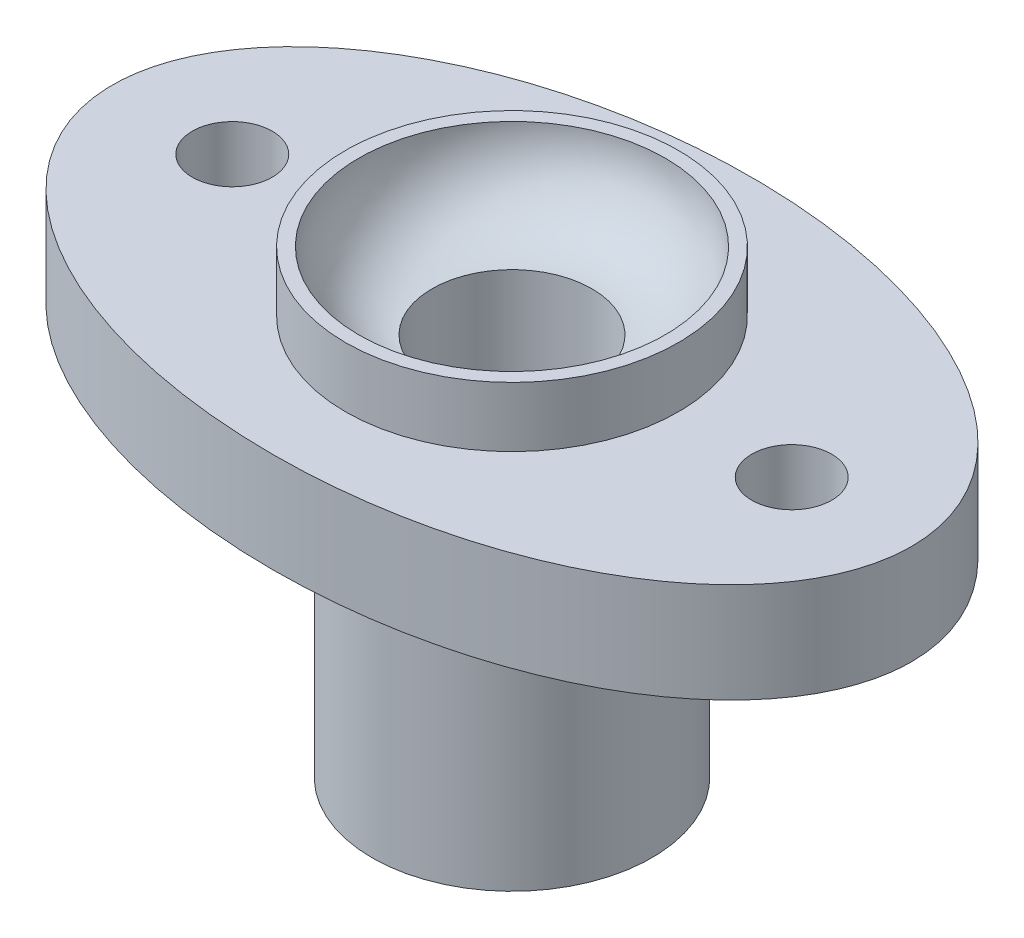
ISO-10303-21;
HEADER;
FILE_DESCRIPTION(('STEP AP214'),'2;1');
FILE_NAME('part.step','',(''),(''),'','','');
FILE_SCHEMA(('AUTOMOTIVE_DESIGN { 1 0 10303 214 1 1 1 1 }'));
ENDSEC;
DATA;
#1=APPLICATION_CONTEXT('core data for automotive mechanical design processes');
#2=APPLICATION_PROTOCOL_DEFINITION('international standard','automotive_design',2000,#1);
#3=PRODUCT_CONTEXT('',#1,'mechanical');
#4=PRODUCT('Part','Part','',(#3));
#5=PRODUCT_RELATED_PRODUCT_CATEGORY('part','',(#4));
#6=PRODUCT_DEFINITION_FORMATION('','',#4);
#7=PRODUCT_DEFINITION_CONTEXT('part definition',#1,'design');
#8=PRODUCT_DEFINITION('design','',#6,#7);
#9=PRODUCT_DEFINITION_SHAPE('','',#8);
#10=(LENGTH_UNIT() NAMED_UNIT(*) SI_UNIT(.MILLI.,.METRE.));
#11=(NAMED_UNIT(*) PLANE_ANGLE_UNIT() SI_UNIT($,.RADIAN.));
#12=(NAMED_UNIT(*) SI_UNIT($,.STERADIAN.) SOLID_ANGLE_UNIT());
#13=UNCERTAINTY_MEASURE_WITH_UNIT(LENGTH_MEASURE(1.E-05),#10,'distance_accuracy_value','');
#14=(GEOMETRIC_REPRESENTATION_CONTEXT(3) GLOBAL_UNCERTAINTY_ASSIGNED_CONTEXT((#13)) GLOBAL_UNIT_ASSIGNED_CONTEXT((#10,
#11,#12)) REPRESENTATION_CONTEXT('',''));
#15=CARTESIAN_POINT('',(0.,0.,0.));
#16=DIRECTION('',(0.,0.,1.));
#17=DIRECTION('',(1.,0.,0.));
#18=AXIS2_PLACEMENT_3D('',#15,#16,#17);
#19=CARTESIAN_POINT('',(0.,45.,0.));
#20=DIRECTION('',(0.,-1.,0.));
#21=DIRECTION('',(0.,0.,-1.));
#22=AXIS2_PLACEMENT_3D('',#19,#20,#21);
#23=CYLINDRICAL_SURFACE('',#22,12.);
#24=CARTESIAN_POINT('',(0.,2.41154273188011,0.));
#25=DIRECTION('',(0.,-1.,0.));
#26=DIRECTION('',(0.,0.,-1.));
#27=AXIS2_PLACEMENT_3D('',#24,#25,#26);
#28=CIRCLE('',#27,12.);
#29=CARTESIAN_POINT('',(0.,2.41154273188011,-12.));
#30=VERTEX_POINT('',#29);
#31=EDGE_CURVE('E72',#30,#30,#28,.F.);
#32=CARTESIAN_POINT('',(0.,57.5108747069239,0.));
#33=DIRECTION('',(0.,1.,0.));
#34=DIRECTION('',(0.,0.,1.));
#35=AXIS2_PLACEMENT_3D('',#32,#33,#34);
#36=CIRCLE('',#35,12.);
#37=CARTESIAN_POINT('',(0.,57.5108747069239,-12.));
#38=VERTEX_POINT('',#37);
#39=EDGE_CURVE('E75',#38,#38,#36,.T.);
#40=CARTESIAN_POINT('',(0.,2.41154273188011,-12.));
#41=CARTESIAN_POINT('',(0.,2.98549410662015,-12.));
#42=CARTESIAN_POINT('',(0.,3.55944548136019,-12.));
#43=CARTESIAN_POINT('',(0.,4.70734823084027,-12.));
#44=CARTESIAN_POINT('',(0.,5.28129960558031,-12.));
#45=CARTESIAN_POINT('',(0.,6.42920235506039,-12.));
#46=CARTESIAN_POINT('',(0.,7.00315372980043,-12.));
#47=CARTESIAN_POINT('',(0.,8.15105647928051,-12.));
#48=CARTESIAN_POINT('',(0.,8.72500785402055,-12.));
#49=CARTESIAN_POINT('',(0.,9.87291060350063,-12.));
#50=CARTESIAN_POINT('',(0.,10.4468619782407,-12.));
#51=CARTESIAN_POINT('',(0.,11.5947647277208,-12.));
#52=CARTESIAN_POINT('',(0.,12.1687161024608,-12.));
#53=CARTESIAN_POINT('',(0.,13.3166188519409,-12.));
#54=CARTESIAN_POINT('',(0.,13.8905702266809,-12.));
#55=CARTESIAN_POINT('',(0.,15.038472976161,-12.));
#56=CARTESIAN_POINT('',(0.,15.612424350901,-12.));
#57=CARTESIAN_POINT('',(0.,16.7603271003811,-12.));
#58=CARTESIAN_POINT('',(0.,17.3342784751211,-12.));
#59=CARTESIAN_POINT('',(0.,18.4821812246012,-12.));
#60=CARTESIAN_POINT('',(0.,19.0561325993413,-12.));
#61=CARTESIAN_POINT('',(0.,20.2040353488213,-12.));
#62=CARTESIAN_POINT('',(0.,20.7779867235614,-12.));
#63=CARTESIAN_POINT('',(0.,21.9258894730415,-12.));
#64=CARTESIAN_POINT('',(0.,22.4998408477815,-12.));
#65=CARTESIAN_POINT('',(0.,23.6477435972616,-12.));
#66=CARTESIAN_POINT('',(0.,24.2216949720016,-12.));
#67=CARTESIAN_POINT('',(0.,25.3695977214817,-12.));
#68=CARTESIAN_POINT('',(0.,25.9435490962217,-12.));
#69=CARTESIAN_POINT('',(0.,27.0914518457018,-12.));
#70=CARTESIAN_POINT('',(0.,27.6654032204419,-12.));
#71=CARTESIAN_POINT('',(0.,28.8133059699219,-12.));
#72=CARTESIAN_POINT('',(0.,29.387257344662,-12.));
#73=CARTESIAN_POINT('',(0.,30.5351600941421,-12.));
#74=CARTESIAN_POINT('',(0.,31.1091114688821,-12.));
#75=CARTESIAN_POINT('',(0.,32.2570142183622,-12.));
#76=CARTESIAN_POINT('',(0.,32.8309655931022,-12.));
#77=CARTESIAN_POINT('',(0.,33.9788683425823,-12.));
#78=CARTESIAN_POINT('',(0.,34.5528197173223,-12.));
#79=CARTESIAN_POINT('',(0.,35.7007224668024,-12.));
#80=CARTESIAN_POINT('',(0.,36.2746738415425,-12.));
#81=CARTESIAN_POINT('',(0.,37.4225765910225,-12.));
#82=CARTESIAN_POINT('',(0.,37.9965279657626,-12.));
#83=CARTESIAN_POINT('',(0.,39.1444307152427,-12.));
#84=CARTESIAN_POINT('',(0.,39.7183820899827,-12.));
#85=CARTESIAN_POINT('',(0.,40.8662848394628,-12.));
#86=CARTESIAN_POINT('',(0.,41.4402362142028,-12.));
#87=CARTESIAN_POINT('',(0.,42.5881389636829,-12.));
#88=CARTESIAN_POINT('',(0.,43.1620903384229,-12.));
#89=CARTESIAN_POINT('',(0.,44.309993087903,-12.));
#90=CARTESIAN_POINT('',(0.,44.8839444626431,-12.));
#91=CARTESIAN_POINT('',(0.,46.0318472121231,-12.));
#92=CARTESIAN_POINT('',(0.,46.6057985868632,-12.));
#93=CARTESIAN_POINT('',(0.,47.7537013363433,-12.));
#94=CARTESIAN_POINT('',(0.,48.3276527110833,-12.));
#95=CARTESIAN_POINT('',(0.,49.4755554605634,-12.));
#96=CARTESIAN_POINT('',(0.,50.0495068353034,-12.));
#97=CARTESIAN_POINT('',(0.,51.1974095847835,-12.));
#98=CARTESIAN_POINT('',(0.,51.7713609595235,-12.));
#99=CARTESIAN_POINT('',(0.,52.9192637090036,-12.));
#100=CARTESIAN_POINT('',(0.,53.4932150837437,-12.));
#101=CARTESIAN_POINT('',(0.,54.6411178332237,-12.));
#102=CARTESIAN_POINT('',(0.,55.2150692079638,-12.));
#103=CARTESIAN_POINT('',(0.,56.3629719574439,-12.));
#104=CARTESIAN_POINT('',(0.,56.9369233321839,-12.));
#105=CARTESIAN_POINT('',(0.,57.5108747069239,-12.));
#106=B_SPLINE_CURVE_WITH_KNOTS('',3,(#40,#41,#42,#43,#44,#45,#46,#47,#48,#49,#50,#51,#52,#53,
#54,#55,#56,#57,#58,#59,#60,#61,#62,#63,#64,#65,#66,#67,#68,#69,#70,#71,#72,#73,#74,#75,#76,#77,
#78,#79,#80,#81,#82,#83,#84,#85,#86,#87,#88,#89,#90,#91,#92,#93,#94,#95,#96,#97,#98,#99,#100,
#101,#102,#103,#104,#105),.UNSPECIFIED.,.F.,.F.,(4,2,2,2,2,2,2,2,2,2,2,2,2,2,2,2,2,2,2,2,2,2,2,
2,2,2,2,2,2,2,2,2,4),(0.,1.72185412422012,3.44370824844024,5.16556237266036,6.88741649688048,
8.6092706211006,10.3311247453207,12.0529788695408,13.774832993761,15.4966871179811,
17.2185412422012,18.9403953664213,20.6622494906414,22.3841036148616,24.1059577390817,
25.8278118633018,27.5496659875219,29.271520111742,30.9933742359622,32.7152283601823,
34.4370824844024,36.1589366086225,37.8807907328426,39.6026448570628,41.3244989812829,
43.046353105503,44.7682072297231,46.4900613539432,48.2119154781633,49.9337696023835,
51.6556237266036,53.3774778508237,55.0993319750438),.UNSPECIFIED.);
#107=EDGE_CURVE('BSEAM31',#30,#38,#106,.T.);
#108=ORIENTED_EDGE('',*,*,#31,.F.);
#109=ORIENTED_EDGE('',*,*,#39,.T.);
#110=ORIENTED_EDGE('',*,*,#107,.T.);
#111=ORIENTED_EDGE('',*,*,#107,.F.);
#112=EDGE_LOOP('',(#108,#110,#109,#111));
#113=FACE_BOUND('',#112,.T.);
#114=ADVANCED_FACE('F31',(#113),#23,.F.);
#115=CARTESIAN_POINT('',(0.,45.,0.));
#116=DIRECTION('',(0.,-1.,0.));
#117=DIRECTION('',(0.,0.,-1.));
#118=AXIS2_PLACEMENT_3D('',#115,#116,#117);
#119=CYLINDRICAL_SURFACE('',#118,21.);
#120=CARTESIAN_POINT('',(0.,45.,0.));
#121=DIRECTION('',(0.,1.,0.));
#122=DIRECTION('',(0.,0.,1.));
#123=AXIS2_PLACEMENT_3D('',#120,#121,#122);
#124=CIRCLE('',#123,21.);
#125=CARTESIAN_POINT('',(0.,45.,-21.));
#126=VERTEX_POINT('',#125);
#127=EDGE_CURVE('E10',#126,#126,#124,.T.);
#128=CARTESIAN_POINT('',(0.,0.,0.));
#129=DIRECTION('',(0.,-1.,0.));
#130=DIRECTION('',(0.,0.,-1.));
#131=AXIS2_PLACEMENT_3D('',#128,#129,#130);
#132=CIRCLE('',#131,21.);
#133=CARTESIAN_POINT('',(0.,0.,-21.));
#134=VERTEX_POINT('',#133);
#135=EDGE_CURVE('E148',#134,#134,#132,.T.);
#136=CARTESIAN_POINT('',(0.,45.,-21.));
#137=CARTESIAN_POINT('',(0.,44.53125,-21.));
#138=CARTESIAN_POINT('',(0.,44.0625,-21.));
#139=CARTESIAN_POINT('',(0.,43.125,-21.));
#140=CARTESIAN_POINT('',(0.,42.65625,-21.));
#141=CARTESIAN_POINT('',(0.,41.71875,-21.));
#142=CARTESIAN_POINT('',(0.,41.25,-21.));
#143=CARTESIAN_POINT('',(0.,40.3125,-21.));
#144=CARTESIAN_POINT('',(0.,39.84375,-21.));
#145=CARTESIAN_POINT('',(0.,38.90625,-21.));
#146=CARTESIAN_POINT('',(0.,38.4375,-21.));
#147=CARTESIAN_POINT('',(0.,37.5,-21.));
#148=CARTESIAN_POINT('',(0.,37.03125,-21.));
#149=CARTESIAN_POINT('',(0.,36.09375,-21.));
#150=CARTESIAN_POINT('',(0.,35.625,-21.));
#151=CARTESIAN_POINT('',(0.,34.6875,-21.));
#152=CARTESIAN_POINT('',(0.,34.21875,-21.));
#153=CARTESIAN_POINT('',(0.,33.28125,-21.));
#154=CARTESIAN_POINT('',(0.,32.8125,-21.));
#155=CARTESIAN_POINT('',(0.,31.875,-21.));
#156=CARTESIAN_POINT('',(0.,31.40625,-21.));
#157=CARTESIAN_POINT('',(0.,30.46875,-21.));
#158=CARTESIAN_POINT('',(0.,30.,-21.));
#159=CARTESIAN_POINT('',(0.,29.0625,-21.));
#160=CARTESIAN_POINT('',(0.,28.59375,-21.));
#161=CARTESIAN_POINT('',(0.,27.65625,-21.));
#162=CARTESIAN_POINT('',(0.,27.1875,-21.));
#163=CARTESIAN_POINT('',(0.,26.25,-21.));
#164=CARTESIAN_POINT('',(0.,25.78125,-21.));
#165=CARTESIAN_POINT('',(0.,24.84375,-21.));
#166=CARTESIAN_POINT('',(0.,24.375,-21.));
#167=CARTESIAN_POINT('',(0.,23.4375,-21.));
#168=CARTESIAN_POINT('',(0.,22.96875,-21.));
#169=CARTESIAN_POINT('',(0.,22.03125,-21.));
#170=CARTESIAN_POINT('',(0.,21.5625,-21.));
#171=CARTESIAN_POINT('',(0.,20.625,-21.));
#172=CARTESIAN_POINT('',(0.,20.15625,-21.));
#173=CARTESIAN_POINT('',(0.,19.21875,-21.));
#174=CARTESIAN_POINT('',(0.,18.75,-21.));
#175=CARTESIAN_POINT('',(0.,17.8125,-21.));
#176=CARTESIAN_POINT('',(0.,17.34375,-21.));
#177=CARTESIAN_POINT('',(0.,16.40625,-21.));
#178=CARTESIAN_POINT('',(0.,15.9375,-21.));
#179=CARTESIAN_POINT('',(0.,15.,-21.));
#180=CARTESIAN_POINT('',(0.,14.53125,-21.));
#181=CARTESIAN_POINT('',(0.,13.59375,-21.));
#182=CARTESIAN_POINT('',(0.,13.125,-21.));
#183=CARTESIAN_POINT('',(0.,12.1875,-21.));
#184=CARTESIAN_POINT('',(0.,11.71875,-21.));
#185=CARTESIAN_POINT('',(0.,10.78125,-21.));
#186=CARTESIAN_POINT('',(0.,10.3125,-21.));
#187=CARTESIAN_POINT('',(0.,9.37500000000001,-21.));
#188=CARTESIAN_POINT('',(0.,8.90625000000001,-21.));
#189=CARTESIAN_POINT('',(0.,7.96875000000001,-21.));
#190=CARTESIAN_POINT('',(0.,7.50000000000001,-21.));
#191=CARTESIAN_POINT('',(0.,6.56250000000001,-21.));
#192=CARTESIAN_POINT('',(0.,6.09375000000001,-21.));
#193=CARTESIAN_POINT('',(0.,5.15625000000001,-21.));
#194=CARTESIAN_POINT('',(0.,4.68750000000001,-21.));
#195=CARTESIAN_POINT('',(0.,3.75000000000001,-21.));
#196=CARTESIAN_POINT('',(0.,3.28125000000001,-21.));
#197=CARTESIAN_POINT('',(0.,2.34375000000001,-21.));
#198=CARTESIAN_POINT('',(0.,1.87500000000001,-21.));
#199=CARTESIAN_POINT('',(0.,0.937500000000006,-21.));
#200=CARTESIAN_POINT('',(0.,0.468750000000007,-21.));
#201=CARTESIAN_POINT('',(0.,0.,-21.));
#202=B_SPLINE_CURVE_WITH_KNOTS('',3,(#136,#137,#138,#139,#140,#141,#142,#143,#144,#145,#146,
#147,#148,#149,#150,#151,#152,#153,#154,#155,#156,#157,#158,#159,#160,#161,#162,#163,#164,#165,
#166,#167,#168,#169,#170,#171,#172,#173,#174,#175,#176,#177,#178,#179,#180,#181,#182,#183,#184,
#185,#186,#187,#188,#189,#190,#191,#192,#193,#194,#195,#196,#197,#198,#199,#200,#201),
.UNSPECIFIED.,.F.,.F.,(4,2,2,2,2,2,2,2,2,2,2,2,2,2,2,2,2,2,2,2,2,2,2,2,2,2,2,2,2,2,2,2,4),(0.,
1.40625,2.8125,4.21875,5.62500000000001,7.03125,8.4375,9.84375,11.25,12.65625,14.0625,15.46875,
16.875,18.28125,19.6875,21.09375,22.5,23.90625,25.3125,26.71875,28.125,29.53125,30.9375,
32.34375,33.75,35.15625,36.5625,37.96875,39.375,40.78125,42.1875,43.59375,45.),.UNSPECIFIED.);
#203=EDGE_CURVE('BSEAM33',#126,#134,#202,.T.);
#204=ORIENTED_EDGE('',*,*,#127,.F.);
#205=ORIENTED_EDGE('',*,*,#135,.F.);
#206=ORIENTED_EDGE('',*,*,#203,.T.);
#207=ORIENTED_EDGE('',*,*,#203,.F.);
#208=EDGE_LOOP('',(#204,#206,#205,#207));
#209=FACE_BOUND('',#208,.T.);
#210=ADVANCED_FACE('F33',(#209),#119,.T.);
#211=CARTESIAN_POINT('',(0.,60.,0.));
#212=DIRECTION('',(0.,1.,0.));
#213=DIRECTION('',(0.,0.,1.));
#214=AXIS2_PLACEMENT_3D('',#211,#212,#213);
#215=PLANE('',#214);
#216=CARTESIAN_POINT('',(0.,60.,0.));
#217=DIRECTION('',(0.,1.,0.));
#218=DIRECTION('',(0.,0.,1.));
#219=AXIS2_PLACEMENT_3D('',#216,#217,#218);
#220=CIRCLE('',#219,25.);
#221=CARTESIAN_POINT('',(0.,60.,25.));
#222=VERTEX_POINT('',#221);
#223=EDGE_CURVE('E77',#222,#222,#220,.T.);
#224=ORIENTED_EDGE('',*,*,#223,.F.);
#225=EDGE_LOOP('',(#224));
#226=FACE_BOUND('',#225,.T.);
#227=CARTESIAN_POINT('',(42.,60.,0.));
#228=DIRECTION('',(0.,1.,0.));
#229=DIRECTION('',(0.,0.,-1.));
#230=AXIS2_PLACEMENT_3D('',#227,#228,#229);
#231=CIRCLE('',#230,5.99999999999999);
#232=CARTESIAN_POINT('',(42.,60.,-5.99999999999999));
#233=VERTEX_POINT('',#232);
#234=EDGE_CURVE('E89',#233,#233,#231,.T.);
#235=ORIENTED_EDGE('',*,*,#234,.F.);
#236=EDGE_LOOP('',(#235));
#237=FACE_BOUND('',#236,.T.);
#238=CARTESIAN_POINT('',(0.,60.,0.));
#239=DIRECTION('',(0.,1.,0.));
#240=DIRECTION('',(1.,0.,0.));
#241=AXIS2_PLACEMENT_3D('',#238,#239,#240);
#242=ELLIPSE('',#241,60.,36.);
#243=CARTESIAN_POINT('',(60.,60.,0.));
#244=VERTEX_POINT('',#243);
#245=EDGE_CURVE('E39',#244,#244,#242,.T.);
#246=ORIENTED_EDGE('',*,*,#245,.T.);
#247=EDGE_LOOP('',(#246));
#248=FACE_BOUND('',#247,.T.);
#249=CARTESIAN_POINT('',(-42.,60.,0.));
#250=DIRECTION('',(0.,1.,0.));
#251=DIRECTION('',(0.,0.,1.));
#252=AXIS2_PLACEMENT_3D('',#249,#250,#251);
#253=CIRCLE('',#252,5.99999999999999);
#254=CARTESIAN_POINT('',(-42.,60.,5.99999999999999));
#255=VERTEX_POINT('',#254);
#256=EDGE_CURVE('E47',#255,#255,#253,.T.);
#257=ORIENTED_EDGE('',*,*,#256,.F.);
#258=EDGE_LOOP('',(#257));
#259=FACE_BOUND('',#258,.T.);
#260=ADVANCED_FACE('F67',(#226,#237,#248,#259),#215,.T.);
#261=CARTESIAN_POINT('',(0.,45.,0.));
#262=DIRECTION('',(0.,1.,0.));
#263=DIRECTION('',(0.,0.,1.));
#264=AXIS2_PLACEMENT_3D('',#261,#262,#263);
#265=PLANE('',#264);
#266=ORIENTED_EDGE('',*,*,#127,.T.);
#267=EDGE_LOOP('',(#266));
#268=FACE_BOUND('',#267,.T.);
#269=CARTESIAN_POINT('',(0.,45.,0.));
#270=DIRECTION('',(0.,1.,0.));
#271=DIRECTION('',(1.,0.,0.));
#272=AXIS2_PLACEMENT_3D('',#269,#270,#271);
#273=ELLIPSE('',#272,60.,36.);
#274=CARTESIAN_POINT('',(60.,45.,0.));
#275=VERTEX_POINT('',#274);
#276=EDGE_CURVE('E43',#275,#275,#273,.T.);
#277=ORIENTED_EDGE('',*,*,#276,.F.);
#278=EDGE_LOOP('',(#277));
#279=FACE_BOUND('',#278,.T.);
#280=CARTESIAN_POINT('',(-42.,45.,0.));
#281=DIRECTION('',(0.,1.,0.));
#282=DIRECTION('',(0.,0.,1.));
#283=AXIS2_PLACEMENT_3D('',#280,#281,#282);
#284=CIRCLE('',#283,5.99999999999999);
#285=CARTESIAN_POINT('',(-42.,45.,5.99999999999999));
#286=VERTEX_POINT('',#285);
#287=EDGE_CURVE('E50',#286,#286,#284,.T.);
#288=ORIENTED_EDGE('',*,*,#287,.T.);
#289=EDGE_LOOP('',(#288));
#290=FACE_BOUND('',#289,.T.);
#291=CARTESIAN_POINT('',(42.,45.,0.));
#292=DIRECTION('',(0.,1.,0.));
#293=DIRECTION('',(0.,0.,-1.));
#294=AXIS2_PLACEMENT_3D('',#291,#292,#293);
#295=CIRCLE('',#294,5.99999999999999);
#296=CARTESIAN_POINT('',(42.,45.,-5.99999999999999));
#297=VERTEX_POINT('',#296);
#298=EDGE_CURVE('E87',#297,#297,#295,.T.);
#299=ORIENTED_EDGE('',*,*,#298,.T.);
#300=EDGE_LOOP('',(#299));
#301=FACE_BOUND('',#300,.T.);
#302=ADVANCED_FACE('F57',(#268,#279,#290,#301),#265,.F.);
#303=DIRECTION('',(0.,-1.,0.));
#304=VECTOR('',#303,1.);
#305=SURFACE_OF_LINEAR_EXTRUSION('',#242,#304);
#306=ORIENTED_EDGE('',*,*,#245,.F.);
#307=EDGE_LOOP('',(#306));
#308=FACE_BOUND('',#307,.T.);
#309=ORIENTED_EDGE('',*,*,#276,.T.);
#310=EDGE_LOOP('',(#309));
#311=FACE_BOUND('',#310,.T.);
#312=ADVANCED_FACE('F53',(#308,#311),#305,.F.);
#313=CARTESIAN_POINT('',(-42.,60.,0.));
#314=DIRECTION('',(0.,-1.,0.));
#315=DIRECTION('',(0.,0.,-1.));
#316=AXIS2_PLACEMENT_3D('',#313,#314,#315);
#317=CYLINDRICAL_SURFACE('',#316,5.99999999999999);
#318=ORIENTED_EDGE('',*,*,#256,.T.);
#319=EDGE_LOOP('',(#318));
#320=FACE_BOUND('',#319,.T.);
#321=ORIENTED_EDGE('',*,*,#287,.F.);
#322=EDGE_LOOP('',(#321));
#323=FACE_BOUND('',#322,.T.);
#324=ADVANCED_FACE('F56',(#320,#323),#317,.F.);
#325=CARTESIAN_POINT('',(42.,60.,0.));
#326=DIRECTION('',(0.,-1.,0.));
#327=DIRECTION('',(0.,0.,-1.));
#328=AXIS2_PLACEMENT_3D('',#325,#326,#327);
#329=CYLINDRICAL_SURFACE('',#328,5.99999999999999);
#330=ORIENTED_EDGE('',*,*,#234,.T.);
#331=EDGE_LOOP('',(#330));
#332=FACE_BOUND('',#331,.T.);
#333=ORIENTED_EDGE('',*,*,#298,.F.);
#334=EDGE_LOOP('',(#333));
#335=FACE_BOUND('',#334,.T.);
#336=ADVANCED_FACE('F102',(#332,#335),#329,.F.);
#337=CARTESIAN_POINT('',(0.,69.,0.));
#338=DIRECTION('',(0.,1.,0.));
#339=DIRECTION('',(0.,0.,1.));
#340=AXIS2_PLACEMENT_3D('',#337,#338,#339);
#341=PLANE('',#340);
#342=CARTESIAN_POINT('',(0.,69.,0.));
#343=DIRECTION('',(0.,1.,0.));
#344=DIRECTION('',(0.,0.,1.));
#345=AXIS2_PLACEMENT_3D('',#342,#343,#344);
#346=CIRCLE('',#345,23.);
#347=CARTESIAN_POINT('',(0.,69.,23.));
#348=VERTEX_POINT('',#347);
#349=EDGE_CURVE('E35',#348,#348,#346,.F.);
#350=ORIENTED_EDGE('',*,*,#349,.T.);
#351=EDGE_LOOP('',(#350));
#352=FACE_BOUND('',#351,.T.);
#353=CARTESIAN_POINT('',(0.,69.,0.));
#354=DIRECTION('',(0.,1.,0.));
#355=DIRECTION('',(0.,0.,1.));
#356=AXIS2_PLACEMENT_3D('',#353,#354,#355);
#357=CIRCLE('',#356,25.);
#358=CARTESIAN_POINT('',(0.,69.,25.));
#359=VERTEX_POINT('',#358);
#360=EDGE_CURVE('E80',#359,#359,#357,.T.);
#361=ORIENTED_EDGE('',*,*,#360,.T.);
#362=EDGE_LOOP('',(#361));
#363=FACE_BOUND('',#362,.T.);
#364=ADVANCED_FACE('F107',(#352,#363),#341,.T.);
#365=CARTESIAN_POINT('',(0.,69.,0.));
#366=DIRECTION('',(0.,-1.,0.));
#367=DIRECTION('',(0.,0.,-1.));
#368=AXIS2_PLACEMENT_3D('',#365,#366,#367);
#369=CYLINDRICAL_SURFACE('',#368,25.);
#370=ORIENTED_EDGE('',*,*,#360,.F.);
#371=EDGE_LOOP('',(#370));
#372=FACE_BOUND('',#371,.T.);
#373=ORIENTED_EDGE('',*,*,#223,.T.);
#374=EDGE_LOOP('',(#373));
#375=FACE_BOUND('',#374,.T.);
#376=ADVANCED_FACE('F128',(#372,#375),#369,.T.);
#377=CARTESIAN_POINT('',(0.,69.,0.));
#378=DIRECTION('',(0.,-1.,0.));
#379=DIRECTION('',(0.,0.,-1.));
#380=AXIS2_PLACEMENT_3D('',#377,#378,#379);
#381=TOROIDAL_SURFACE('',#380,11.5,11.5);
#382=ORIENTED_EDGE('',*,*,#39,.F.);
#383=EDGE_LOOP('',(#382));
#384=FACE_BOUND('',#383,.T.);
#385=ORIENTED_EDGE('',*,*,#349,.F.);
#386=EDGE_LOOP('',(#385));
#387=FACE_BOUND('',#386,.T.);
#388=ADVANCED_FACE('F130',(#384,#387),#381,.F.);
#389=CARTESIAN_POINT('',(0.,0.,0.));
#390=DIRECTION('',(0.,-1.,0.));
#391=DIRECTION('',(0.,0.,-1.));
#392=AXIS2_PLACEMENT_3D('',#389,#390,#391);
#393=CONICAL_SURFACE('',#392,21.,1.30899693899575);
#394=ORIENTED_EDGE('',*,*,#31,.T.);
#395=EDGE_LOOP('',(#394));
#396=FACE_BOUND('',#395,.T.);
#397=ORIENTED_EDGE('',*,*,#135,.T.);
#398=EDGE_LOOP('',(#397));
#399=FACE_BOUND('',#398,.T.);
#400=ADVANCED_FACE('F136',(#396,#399),#393,.F.);
#401=CLOSED_SHELL('',(#114,#210,#260,#302,#312,#324,#336,#364,#376,#388,#400));
#402=MANIFOLD_SOLID_BREP('B2',#401);
#403=ADVANCED_BREP_SHAPE_REPRESENTATION('',(#18,#402),#14);
#404=SHAPE_DEFINITION_REPRESENTATION(#9,#403);
ENDSEC;
END-ISO-10303-21;
